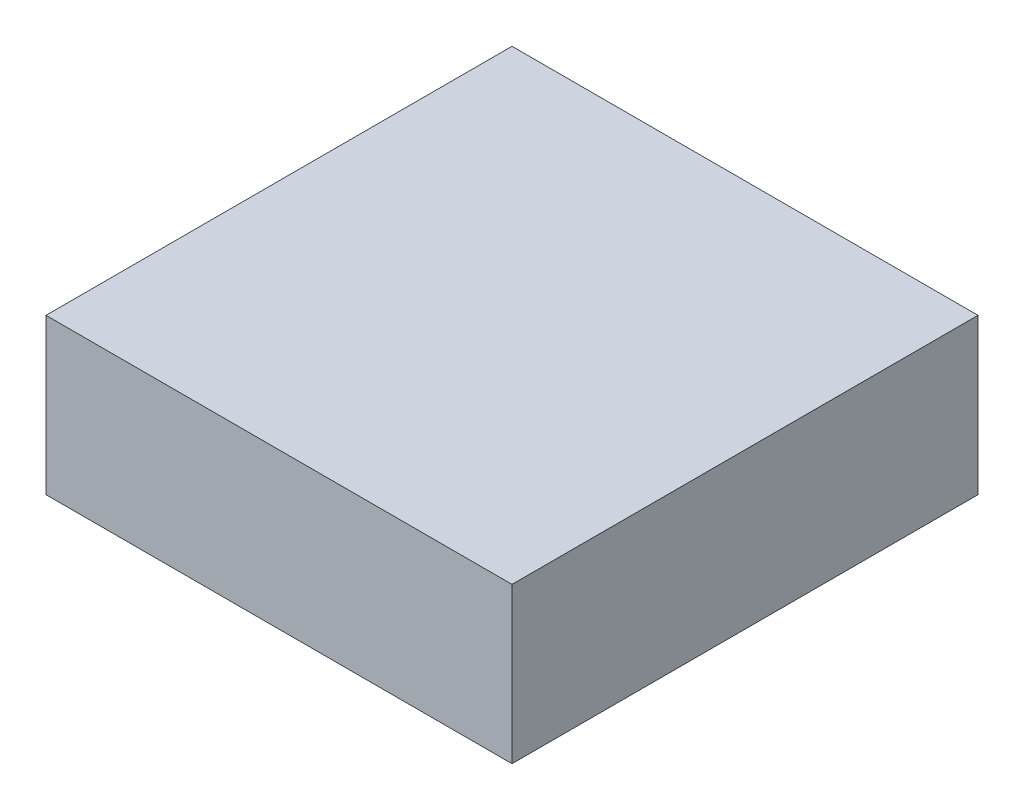
ISO-10303-21;
HEADER;
FILE_DESCRIPTION(('STEP AP214'),'2;1');
FILE_NAME('part.step','',(''),(''),'','','');
FILE_SCHEMA(('AUTOMOTIVE_DESIGN { 1 0 10303 214 1 1 1 1 }'));
ENDSEC;
DATA;
#1=APPLICATION_CONTEXT('core data for automotive mechanical design processes');
#2=APPLICATION_PROTOCOL_DEFINITION('international standard','automotive_design',2000,#1);
#3=PRODUCT_CONTEXT('',#1,'mechanical');
#4=PRODUCT('Part','Part','',(#3));
#5=PRODUCT_RELATED_PRODUCT_CATEGORY('part','',(#4));
#6=PRODUCT_DEFINITION_FORMATION('','',#4);
#7=PRODUCT_DEFINITION_CONTEXT('part definition',#1,'design');
#8=PRODUCT_DEFINITION('design','',#6,#7);
#9=PRODUCT_DEFINITION_SHAPE('','',#8);
#10=(LENGTH_UNIT() NAMED_UNIT(*) SI_UNIT(.MILLI.,.METRE.));
#11=(NAMED_UNIT(*) PLANE_ANGLE_UNIT() SI_UNIT($,.RADIAN.));
#12=(NAMED_UNIT(*) SI_UNIT($,.STERADIAN.) SOLID_ANGLE_UNIT());
#13=UNCERTAINTY_MEASURE_WITH_UNIT(LENGTH_MEASURE(1.E-05),#10,'distance_accuracy_value','');
#14=(GEOMETRIC_REPRESENTATION_CONTEXT(3) GLOBAL_UNCERTAINTY_ASSIGNED_CONTEXT((#13)) GLOBAL_UNIT_ASSIGNED_CONTEXT((#10,
#11,#12)) REPRESENTATION_CONTEXT('',''));
#15=CARTESIAN_POINT('',(0.,0.,0.));
#16=DIRECTION('',(0.,0.,1.));
#17=DIRECTION('',(1.,0.,0.));
#18=AXIS2_PLACEMENT_3D('',#15,#16,#17);
#19=CARTESIAN_POINT('',(0.,1.,0.));
#20=DIRECTION('',(-1.,0.,0.));
#21=DIRECTION('',(0.,0.,1.));
#22=AXIS2_PLACEMENT_3D('',#19,#20,#21);
#23=PLANE('',#22);
#24=DIRECTION('',(0.,0.,-1.));
#25=VECTOR('',#24,1.);
#26=CARTESIAN_POINT('',(0.,0.,0.));
#27=LINE('',#26,#25);
#28=CARTESIAN_POINT('',(0.,0.,0.));
#29=VERTEX_POINT('',#28);
#30=CARTESIAN_POINT('',(0.,0.,-3.));
#31=VERTEX_POINT('',#30);
#32=EDGE_CURVE('E99',#29,#31,#27,.T.);
#33=ORIENTED_EDGE('',*,*,#32,.F.);
#34=DIRECTION('',(0.,-1.,0.));
#35=VECTOR('',#34,1.);
#36=CARTESIAN_POINT('',(0.,1.,0.));
#37=LINE('',#36,#35);
#38=CARTESIAN_POINT('',(0.,1.,0.));
#39=VERTEX_POINT('',#38);
#40=EDGE_CURVE('E11',#39,#29,#37,.T.);
#41=ORIENTED_EDGE('',*,*,#40,.F.);
#42=DIRECTION('',(0.,0.,-1.));
#43=VECTOR('',#42,1.);
#44=CARTESIAN_POINT('',(0.,1.,0.));
#45=LINE('',#44,#43);
#46=CARTESIAN_POINT('',(0.,1.,-3.));
#47=VERTEX_POINT('',#46);
#48=EDGE_CURVE('E94',#39,#47,#45,.T.);
#49=ORIENTED_EDGE('',*,*,#48,.T.);
#50=DIRECTION('',(0.,-1.,0.));
#51=VECTOR('',#50,1.);
#52=CARTESIAN_POINT('',(0.,1.,-3.));
#53=LINE('',#52,#51);
#54=EDGE_CURVE('E37',#47,#31,#53,.T.);
#55=ORIENTED_EDGE('',*,*,#54,.T.);
#56=EDGE_LOOP('',(#33,#41,#49,#55));
#57=FACE_BOUND('',#56,.T.);
#58=ADVANCED_FACE('F34',(#57),#23,.T.);
#59=CARTESIAN_POINT('',(0.,1.,0.));
#60=DIRECTION('',(0.,0.,-1.));
#61=DIRECTION('',(-1.,0.,0.));
#62=AXIS2_PLACEMENT_3D('',#59,#60,#61);
#63=PLANE('',#62);
#64=DIRECTION('',(1.,0.,0.));
#65=VECTOR('',#64,1.);
#66=CARTESIAN_POINT('',(0.,0.,0.));
#67=LINE('',#66,#65);
#68=CARTESIAN_POINT('',(3.,0.,0.));
#69=VERTEX_POINT('',#68);
#70=EDGE_CURVE('E67',#29,#69,#67,.T.);
#71=ORIENTED_EDGE('',*,*,#70,.T.);
#72=DIRECTION('',(0.,-1.,0.));
#73=VECTOR('',#72,1.);
#74=CARTESIAN_POINT('',(3.,1.,0.));
#75=LINE('',#74,#73);
#76=CARTESIAN_POINT('',(3.,1.,0.));
#77=VERTEX_POINT('',#76);
#78=EDGE_CURVE('E43',#77,#69,#75,.T.);
#79=ORIENTED_EDGE('',*,*,#78,.F.);
#80=DIRECTION('',(1.,0.,0.));
#81=VECTOR('',#80,1.);
#82=CARTESIAN_POINT('',(0.,1.,0.));
#83=LINE('',#82,#81);
#84=EDGE_CURVE('E84',#39,#77,#83,.T.);
#85=ORIENTED_EDGE('',*,*,#84,.F.);
#86=ORIENTED_EDGE('',*,*,#40,.T.);
#87=EDGE_LOOP('',(#71,#79,#85,#86));
#88=FACE_BOUND('',#87,.T.);
#89=ADVANCED_FACE('F109',(#88),#63,.F.);
#90=CARTESIAN_POINT('',(3.,1.,0.));
#91=DIRECTION('',(-1.,0.,0.));
#92=DIRECTION('',(0.,0.,1.));
#93=AXIS2_PLACEMENT_3D('',#90,#91,#92);
#94=PLANE('',#93);
#95=DIRECTION('',(0.,0.,-1.));
#96=VECTOR('',#95,1.);
#97=CARTESIAN_POINT('',(3.,0.,0.));
#98=LINE('',#97,#96);
#99=CARTESIAN_POINT('',(3.,0.,-3.));
#100=VERTEX_POINT('',#99);
#101=EDGE_CURVE('E91',#69,#100,#98,.T.);
#102=ORIENTED_EDGE('',*,*,#101,.T.);
#103=DIRECTION('',(0.,-1.,0.));
#104=VECTOR('',#103,1.);
#105=CARTESIAN_POINT('',(3.,1.,-3.));
#106=LINE('',#105,#104);
#107=CARTESIAN_POINT('',(3.,1.,-3.));
#108=VERTEX_POINT('',#107);
#109=EDGE_CURVE('E88',#108,#100,#106,.T.);
#110=ORIENTED_EDGE('',*,*,#109,.F.);
#111=DIRECTION('',(0.,0.,-1.));
#112=VECTOR('',#111,1.);
#113=CARTESIAN_POINT('',(3.,1.,0.));
#114=LINE('',#113,#112);
#115=EDGE_CURVE('E79',#77,#108,#114,.T.);
#116=ORIENTED_EDGE('',*,*,#115,.F.);
#117=ORIENTED_EDGE('',*,*,#78,.T.);
#118=EDGE_LOOP('',(#102,#110,#116,#117));
#119=FACE_BOUND('',#118,.T.);
#120=ADVANCED_FACE('F89',(#119),#94,.F.);
#121=CARTESIAN_POINT('',(0.,1.,-3.));
#122=DIRECTION('',(0.,0.,-1.));
#123=DIRECTION('',(-1.,0.,0.));
#124=AXIS2_PLACEMENT_3D('',#121,#122,#123);
#125=PLANE('',#124);
#126=DIRECTION('',(1.,0.,0.));
#127=VECTOR('',#126,1.);
#128=CARTESIAN_POINT('',(0.,0.,-3.));
#129=LINE('',#128,#127);
#130=EDGE_CURVE('E102',#31,#100,#129,.T.);
#131=ORIENTED_EDGE('',*,*,#130,.F.);
#132=ORIENTED_EDGE('',*,*,#54,.F.);
#133=DIRECTION('',(1.,0.,0.));
#134=VECTOR('',#133,1.);
#135=CARTESIAN_POINT('',(0.,1.,-3.));
#136=LINE('',#135,#134);
#137=EDGE_CURVE('E83',#47,#108,#136,.T.);
#138=ORIENTED_EDGE('',*,*,#137,.T.);
#139=ORIENTED_EDGE('',*,*,#109,.T.);
#140=EDGE_LOOP('',(#131,#132,#138,#139));
#141=FACE_BOUND('',#140,.T.);
#142=ADVANCED_FACE('F93',(#141),#125,.T.);
#143=CARTESIAN_POINT('',(0.,1.,0.));
#144=DIRECTION('',(0.,-1.,0.));
#145=DIRECTION('',(0.,0.,-1.));
#146=AXIS2_PLACEMENT_3D('',#143,#144,#145);
#147=PLANE('',#146);
#148=ORIENTED_EDGE('',*,*,#48,.F.);
#149=ORIENTED_EDGE('',*,*,#84,.T.);
#150=ORIENTED_EDGE('',*,*,#115,.T.);
#151=ORIENTED_EDGE('',*,*,#137,.F.);
#152=EDGE_LOOP('',(#148,#149,#150,#151));
#153=FACE_BOUND('',#152,.T.);
#154=ADVANCED_FACE('F82',(#153),#147,.F.);
#155=CARTESIAN_POINT('',(0.,0.,0.));
#156=DIRECTION('',(0.,-1.,0.));
#157=DIRECTION('',(0.,0.,-1.));
#158=AXIS2_PLACEMENT_3D('',#155,#156,#157);
#159=PLANE('',#158);
#160=ORIENTED_EDGE('',*,*,#32,.T.);
#161=ORIENTED_EDGE('',*,*,#130,.T.);
#162=ORIENTED_EDGE('',*,*,#101,.F.);
#163=ORIENTED_EDGE('',*,*,#70,.F.);
#164=EDGE_LOOP('',(#160,#161,#162,#163));
#165=FACE_BOUND('',#164,.T.);
#166=ADVANCED_FACE('F107',(#165),#159,.T.);
#167=CLOSED_SHELL('',(#58,#89,#120,#142,#154,#166));
#168=MANIFOLD_SOLID_BREP('B2',#167);
#169=ADVANCED_BREP_SHAPE_REPRESENTATION('',(#18,#168),#14);
#170=SHAPE_DEFINITION_REPRESENTATION(#9,#169);
ENDSEC;
END-ISO-10303-21;
